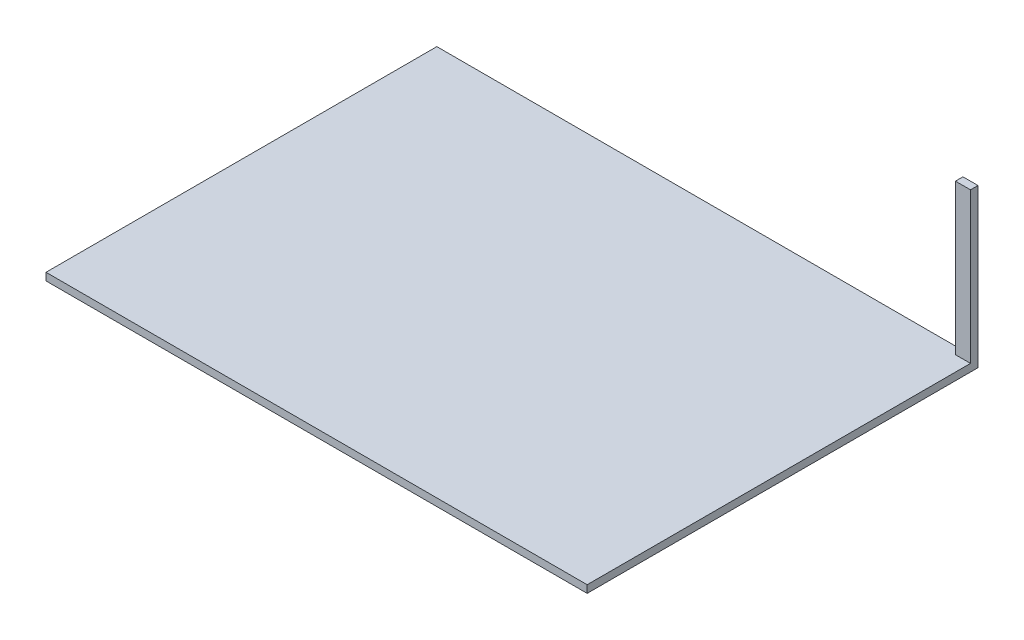
ISO-10303-21;
HEADER;
FILE_DESCRIPTION(('STEP AP214'),'2;1');
FILE_NAME('part.step','',(''),(''),'','','');
FILE_SCHEMA(('AUTOMOTIVE_DESIGN { 1 0 10303 214 1 1 1 1 }'));
ENDSEC;
DATA;
#1=APPLICATION_CONTEXT('core data for automotive mechanical design processes');
#2=APPLICATION_PROTOCOL_DEFINITION('international standard','automotive_design',2000,#1);
#3=PRODUCT_CONTEXT('',#1,'mechanical');
#4=PRODUCT('Part','Part','',(#3));
#5=PRODUCT_RELATED_PRODUCT_CATEGORY('part','',(#4));
#6=PRODUCT_DEFINITION_FORMATION('','',#4);
#7=PRODUCT_DEFINITION_CONTEXT('part definition',#1,'design');
#8=PRODUCT_DEFINITION('design','',#6,#7);
#9=PRODUCT_DEFINITION_SHAPE('','',#8);
#10=(LENGTH_UNIT() NAMED_UNIT(*) SI_UNIT(.MILLI.,.METRE.));
#11=(NAMED_UNIT(*) PLANE_ANGLE_UNIT() SI_UNIT($,.RADIAN.));
#12=(NAMED_UNIT(*) SI_UNIT($,.STERADIAN.) SOLID_ANGLE_UNIT());
#13=UNCERTAINTY_MEASURE_WITH_UNIT(LENGTH_MEASURE(1.E-05),#10,'distance_accuracy_value','');
#14=(GEOMETRIC_REPRESENTATION_CONTEXT(3) GLOBAL_UNCERTAINTY_ASSIGNED_CONTEXT((#13)) GLOBAL_UNIT_ASSIGNED_CONTEXT((#10,
#11,#12)) REPRESENTATION_CONTEXT('',''));
#15=CARTESIAN_POINT('',(0.,0.,0.));
#16=DIRECTION('',(0.,0.,1.));
#17=DIRECTION('',(1.,0.,0.));
#18=AXIS2_PLACEMENT_3D('',#15,#16,#17);
#19=CARTESIAN_POINT('',(0.,5.,0.));
#20=DIRECTION('',(0.,-1.,0.));
#21=DIRECTION('',(0.,0.,-1.));
#22=AXIS2_PLACEMENT_3D('',#19,#20,#21);
#23=PLANE('',#22);
#24=DIRECTION('',(1.,0.,0.));
#25=VECTOR('',#24,1.);
#26=CARTESIAN_POINT('',(180.,5.,-125.));
#27=LINE('',#26,#25);
#28=CARTESIAN_POINT('',(170.,5.,-125.));
#29=VERTEX_POINT('',#28);
#30=CARTESIAN_POINT('',(180.,5.,-125.));
#31=VERTEX_POINT('',#30);
#32=EDGE_CURVE('E111',#29,#31,#27,.T.);
#33=ORIENTED_EDGE('',*,*,#32,.F.);
#34=DIRECTION('',(0.,0.,1.));
#35=VECTOR('',#34,1.);
#36=CARTESIAN_POINT('',(170.,5.,-130.));
#37=LINE('',#36,#35);
#38=CARTESIAN_POINT('',(170.,5.,-130.));
#39=VERTEX_POINT('',#38);
#40=EDGE_CURVE('E47',#39,#29,#37,.T.);
#41=ORIENTED_EDGE('',*,*,#40,.F.);
#42=DIRECTION('',(-1.,0.,0.));
#43=VECTOR('',#42,1.);
#44=CARTESIAN_POINT('',(-180.,5.,-130.));
#45=LINE('',#44,#43);
#46=CARTESIAN_POINT('',(-180.,5.,-130.));
#47=VERTEX_POINT('',#46);
#48=EDGE_CURVE('E125',#39,#47,#45,.T.);
#49=ORIENTED_EDGE('',*,*,#48,.T.);
#50=DIRECTION('',(0.,0.,1.));
#51=VECTOR('',#50,1.);
#52=CARTESIAN_POINT('',(-180.,5.,130.));
#53=LINE('',#52,#51);
#54=CARTESIAN_POINT('',(-180.,5.,130.));
#55=VERTEX_POINT('',#54);
#56=EDGE_CURVE('E128',#47,#55,#53,.T.);
#57=ORIENTED_EDGE('',*,*,#56,.T.);
#58=DIRECTION('',(1.,0.,0.));
#59=VECTOR('',#58,1.);
#60=CARTESIAN_POINT('',(-180.,5.,130.));
#61=LINE('',#60,#59);
#62=CARTESIAN_POINT('',(180.,5.,130.));
#63=VERTEX_POINT('',#62);
#64=EDGE_CURVE('E130',#55,#63,#61,.T.);
#65=ORIENTED_EDGE('',*,*,#64,.T.);
#66=DIRECTION('',(0.,0.,-1.));
#67=VECTOR('',#66,1.);
#68=CARTESIAN_POINT('',(180.,5.,130.));
#69=LINE('',#68,#67);
#70=EDGE_CURVE('E53',#63,#31,#69,.T.);
#71=ORIENTED_EDGE('',*,*,#70,.T.);
#72=EDGE_LOOP('',(#33,#41,#49,#57,#65,#71));
#73=FACE_BOUND('',#72,.T.);
#74=ADVANCED_FACE('F32',(#73),#23,.F.);
#75=CARTESIAN_POINT('',(180.,5.,130.));
#76=DIRECTION('',(-1.,0.,0.));
#77=DIRECTION('',(0.,0.,1.));
#78=AXIS2_PLACEMENT_3D('',#75,#76,#77);
#79=PLANE('',#78);
#80=DIRECTION('',(0.,0.,-1.));
#81=VECTOR('',#80,1.);
#82=CARTESIAN_POINT('',(180.,0.,130.));
#83=LINE('',#82,#81);
#84=CARTESIAN_POINT('',(180.,0.,130.));
#85=VERTEX_POINT('',#84);
#86=CARTESIAN_POINT('',(180.,0.,-130.));
#87=VERTEX_POINT('',#86);
#88=EDGE_CURVE('E96',#85,#87,#83,.T.);
#89=ORIENTED_EDGE('',*,*,#88,.T.);
#90=DIRECTION('',(0.,-1.,0.));
#91=VECTOR('',#90,1.);
#92=CARTESIAN_POINT('',(180.,5.,-130.));
#93=LINE('',#92,#91);
#94=CARTESIAN_POINT('',(180.,105.,-130.));
#95=VERTEX_POINT('',#94);
#96=EDGE_CURVE('E11',#95,#87,#93,.T.);
#97=ORIENTED_EDGE('',*,*,#96,.F.);
#98=DIRECTION('',(0.,0.,-1.));
#99=VECTOR('',#98,1.);
#100=CARTESIAN_POINT('',(180.,105.,-130.));
#101=LINE('',#100,#99);
#102=CARTESIAN_POINT('',(180.,105.,-125.));
#103=VERTEX_POINT('',#102);
#104=EDGE_CURVE('E93',#103,#95,#101,.T.);
#105=ORIENTED_EDGE('',*,*,#104,.F.);
#106=DIRECTION('',(0.,-1.,0.));
#107=VECTOR('',#106,1.);
#108=CARTESIAN_POINT('',(180.,105.,-125.));
#109=LINE('',#108,#107);
#110=EDGE_CURVE('E117',#103,#31,#109,.T.);
#111=ORIENTED_EDGE('',*,*,#110,.T.);
#112=ORIENTED_EDGE('',*,*,#70,.F.);
#113=DIRECTION('',(0.,-1.,0.));
#114=VECTOR('',#113,1.);
#115=CARTESIAN_POINT('',(180.,5.,130.));
#116=LINE('',#115,#114);
#117=EDGE_CURVE('E132',#63,#85,#116,.T.);
#118=ORIENTED_EDGE('',*,*,#117,.T.);
#119=EDGE_LOOP('',(#89,#97,#105,#111,#112,#118));
#120=FACE_BOUND('',#119,.T.);
#121=ADVANCED_FACE('F34',(#120),#79,.F.);
#122=CARTESIAN_POINT('',(-180.,5.,-130.));
#123=DIRECTION('',(0.,0.,1.));
#124=DIRECTION('',(1.,0.,0.));
#125=AXIS2_PLACEMENT_3D('',#122,#123,#124);
#126=PLANE('',#125);
#127=DIRECTION('',(-1.,0.,0.));
#128=VECTOR('',#127,1.);
#129=CARTESIAN_POINT('',(-180.,0.,-130.));
#130=LINE('',#129,#128);
#131=CARTESIAN_POINT('',(-180.,0.,-130.));
#132=VERTEX_POINT('',#131);
#133=EDGE_CURVE('E134',#87,#132,#130,.T.);
#134=ORIENTED_EDGE('',*,*,#133,.T.);
#135=DIRECTION('',(0.,-1.,0.));
#136=VECTOR('',#135,1.);
#137=CARTESIAN_POINT('',(-180.,5.,-130.));
#138=LINE('',#137,#136);
#139=EDGE_CURVE('E40',#47,#132,#138,.T.);
#140=ORIENTED_EDGE('',*,*,#139,.F.);
#141=ORIENTED_EDGE('',*,*,#48,.F.);
#142=DIRECTION('',(0.,-1.,0.));
#143=VECTOR('',#142,1.);
#144=CARTESIAN_POINT('',(170.,105.,-130.));
#145=LINE('',#144,#143);
#146=CARTESIAN_POINT('',(170.,105.,-130.));
#147=VERTEX_POINT('',#146);
#148=EDGE_CURVE('E102',#147,#39,#145,.T.);
#149=ORIENTED_EDGE('',*,*,#148,.F.);
#150=DIRECTION('',(-1.,0.,0.));
#151=VECTOR('',#150,1.);
#152=CARTESIAN_POINT('',(180.,105.,-130.));
#153=LINE('',#152,#151);
#154=EDGE_CURVE('E99',#95,#147,#153,.T.);
#155=ORIENTED_EDGE('',*,*,#154,.F.);
#156=ORIENTED_EDGE('',*,*,#96,.T.);
#157=EDGE_LOOP('',(#134,#140,#141,#149,#155,#156));
#158=FACE_BOUND('',#157,.T.);
#159=ADVANCED_FACE('F100',(#158),#126,.F.);
#160=CARTESIAN_POINT('',(-180.,5.,130.));
#161=DIRECTION('',(1.,0.,0.));
#162=DIRECTION('',(0.,0.,-1.));
#163=AXIS2_PLACEMENT_3D('',#160,#161,#162);
#164=PLANE('',#163);
#165=DIRECTION('',(0.,0.,1.));
#166=VECTOR('',#165,1.);
#167=CARTESIAN_POINT('',(-180.,0.,130.));
#168=LINE('',#167,#166);
#169=CARTESIAN_POINT('',(-180.,0.,130.));
#170=VERTEX_POINT('',#169);
#171=EDGE_CURVE('E136',#132,#170,#168,.T.);
#172=ORIENTED_EDGE('',*,*,#171,.T.);
#173=DIRECTION('',(0.,-1.,0.));
#174=VECTOR('',#173,1.);
#175=CARTESIAN_POINT('',(-180.,5.,130.));
#176=LINE('',#175,#174);
#177=EDGE_CURVE('E140',#55,#170,#176,.T.);
#178=ORIENTED_EDGE('',*,*,#177,.F.);
#179=ORIENTED_EDGE('',*,*,#56,.F.);
#180=ORIENTED_EDGE('',*,*,#139,.T.);
#181=EDGE_LOOP('',(#172,#178,#179,#180));
#182=FACE_BOUND('',#181,.T.);
#183=ADVANCED_FACE('F147',(#182),#164,.F.);
#184=CARTESIAN_POINT('',(-180.,5.,130.));
#185=DIRECTION('',(0.,0.,-1.));
#186=DIRECTION('',(-1.,0.,0.));
#187=AXIS2_PLACEMENT_3D('',#184,#185,#186);
#188=PLANE('',#187);
#189=DIRECTION('',(1.,0.,0.));
#190=VECTOR('',#189,1.);
#191=CARTESIAN_POINT('',(-180.,0.,130.));
#192=LINE('',#191,#190);
#193=EDGE_CURVE('E126',#170,#85,#192,.T.);
#194=ORIENTED_EDGE('',*,*,#193,.T.);
#195=ORIENTED_EDGE('',*,*,#117,.F.);
#196=ORIENTED_EDGE('',*,*,#64,.F.);
#197=ORIENTED_EDGE('',*,*,#177,.T.);
#198=EDGE_LOOP('',(#194,#195,#196,#197));
#199=FACE_BOUND('',#198,.T.);
#200=ADVANCED_FACE('F154',(#199),#188,.F.);
#201=CARTESIAN_POINT('',(0.,0.,0.));
#202=DIRECTION('',(0.,-1.,0.));
#203=DIRECTION('',(0.,0.,-1.));
#204=AXIS2_PLACEMENT_3D('',#201,#202,#203);
#205=PLANE('',#204);
#206=ORIENTED_EDGE('',*,*,#88,.F.);
#207=ORIENTED_EDGE('',*,*,#193,.F.);
#208=ORIENTED_EDGE('',*,*,#171,.F.);
#209=ORIENTED_EDGE('',*,*,#133,.F.);
#210=EDGE_LOOP('',(#206,#207,#208,#209));
#211=FACE_BOUND('',#210,.T.);
#212=ADVANCED_FACE('F151',(#211),#205,.T.);
#213=CARTESIAN_POINT('',(170.,105.,-130.));
#214=DIRECTION('',(1.,0.,0.));
#215=DIRECTION('',(0.,0.,-1.));
#216=AXIS2_PLACEMENT_3D('',#213,#214,#215);
#217=PLANE('',#216);
#218=ORIENTED_EDGE('',*,*,#40,.T.);
#219=DIRECTION('',(0.,-1.,0.));
#220=VECTOR('',#219,1.);
#221=CARTESIAN_POINT('',(170.,105.,-125.));
#222=LINE('',#221,#220);
#223=CARTESIAN_POINT('',(170.,105.,-125.));
#224=VERTEX_POINT('',#223);
#225=EDGE_CURVE('E120',#224,#29,#222,.T.);
#226=ORIENTED_EDGE('',*,*,#225,.F.);
#227=DIRECTION('',(0.,0.,1.));
#228=VECTOR('',#227,1.);
#229=CARTESIAN_POINT('',(170.,105.,-130.));
#230=LINE('',#229,#228);
#231=EDGE_CURVE('E105',#147,#224,#230,.T.);
#232=ORIENTED_EDGE('',*,*,#231,.F.);
#233=ORIENTED_EDGE('',*,*,#148,.T.);
#234=EDGE_LOOP('',(#218,#226,#232,#233));
#235=FACE_BOUND('',#234,.T.);
#236=ADVANCED_FACE('F160',(#235),#217,.F.);
#237=CARTESIAN_POINT('',(180.,105.,-125.));
#238=DIRECTION('',(0.,0.,-1.));
#239=DIRECTION('',(-1.,0.,0.));
#240=AXIS2_PLACEMENT_3D('',#237,#238,#239);
#241=PLANE('',#240);
#242=ORIENTED_EDGE('',*,*,#32,.T.);
#243=ORIENTED_EDGE('',*,*,#110,.F.);
#244=DIRECTION('',(1.,0.,0.));
#245=VECTOR('',#244,1.);
#246=CARTESIAN_POINT('',(180.,105.,-125.));
#247=LINE('',#246,#245);
#248=EDGE_CURVE('E109',#224,#103,#247,.T.);
#249=ORIENTED_EDGE('',*,*,#248,.F.);
#250=ORIENTED_EDGE('',*,*,#225,.T.);
#251=EDGE_LOOP('',(#242,#243,#249,#250));
#252=FACE_BOUND('',#251,.T.);
#253=ADVANCED_FACE('F157',(#252),#241,.F.);
#254=CARTESIAN_POINT('',(0.,105.,0.));
#255=DIRECTION('',(0.,-1.,0.));
#256=DIRECTION('',(0.,0.,-1.));
#257=AXIS2_PLACEMENT_3D('',#254,#255,#256);
#258=PLANE('',#257);
#259=ORIENTED_EDGE('',*,*,#104,.T.);
#260=ORIENTED_EDGE('',*,*,#154,.T.);
#261=ORIENTED_EDGE('',*,*,#231,.T.);
#262=ORIENTED_EDGE('',*,*,#248,.T.);
#263=EDGE_LOOP('',(#259,#260,#261,#262));
#264=FACE_BOUND('',#263,.T.);
#265=ADVANCED_FACE('F107',(#264),#258,.F.);
#266=CLOSED_SHELL('',(#74,#121,#159,#183,#200,#212,#236,#253,#265));
#267=MANIFOLD_SOLID_BREP('B2',#266);
#268=ADVANCED_BREP_SHAPE_REPRESENTATION('',(#18,#267),#14);
#269=SHAPE_DEFINITION_REPRESENTATION(#9,#268);
ENDSEC;
END-ISO-10303-21;
